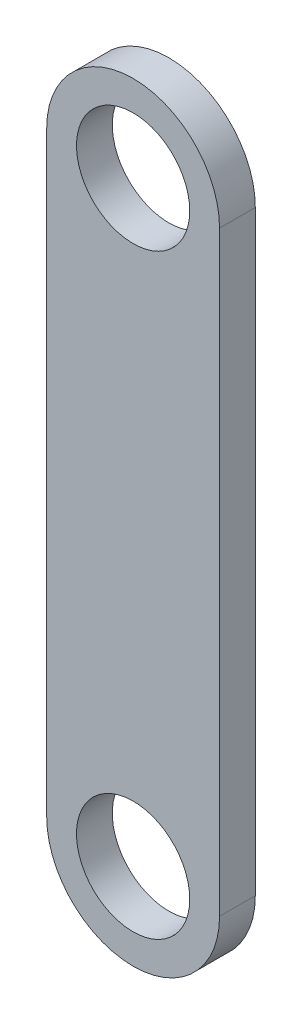
ISO-10303-21;
HEADER;
FILE_DESCRIPTION(('STEP AP214'),'2;1');
FILE_NAME('part.step','',(''),(''),'','','');
FILE_SCHEMA(('AUTOMOTIVE_DESIGN { 1 0 10303 214 1 1 1 1 }'));
ENDSEC;
DATA;
#1=APPLICATION_CONTEXT('core data for automotive mechanical design processes');
#2=APPLICATION_PROTOCOL_DEFINITION('international standard','automotive_design',2000,#1);
#3=PRODUCT_CONTEXT('',#1,'mechanical');
#4=PRODUCT('Part','Part','',(#3));
#5=PRODUCT_RELATED_PRODUCT_CATEGORY('part','',(#4));
#6=PRODUCT_DEFINITION_FORMATION('','',#4);
#7=PRODUCT_DEFINITION_CONTEXT('part definition',#1,'design');
#8=PRODUCT_DEFINITION('design','',#6,#7);
#9=PRODUCT_DEFINITION_SHAPE('','',#8);
#10=(LENGTH_UNIT() NAMED_UNIT(*) SI_UNIT(.MILLI.,.METRE.));
#11=(NAMED_UNIT(*) PLANE_ANGLE_UNIT() SI_UNIT($,.RADIAN.));
#12=(NAMED_UNIT(*) SI_UNIT($,.STERADIAN.) SOLID_ANGLE_UNIT());
#13=UNCERTAINTY_MEASURE_WITH_UNIT(LENGTH_MEASURE(1.E-05),#10,'distance_accuracy_value','');
#14=(GEOMETRIC_REPRESENTATION_CONTEXT(3) GLOBAL_UNCERTAINTY_ASSIGNED_CONTEXT((#13)) GLOBAL_UNIT_ASSIGNED_CONTEXT((#10,
#11,#12)) REPRESENTATION_CONTEXT('',''));
#15=CARTESIAN_POINT('',(0.,0.,0.));
#16=DIRECTION('',(0.,0.,1.));
#17=DIRECTION('',(1.,0.,0.));
#18=AXIS2_PLACEMENT_3D('',#15,#16,#17);
#19=CARTESIAN_POINT('',(14.5,0.,-6.));
#20=DIRECTION('',(-1.,0.,0.));
#21=DIRECTION('',(0.,0.,1.));
#22=AXIS2_PLACEMENT_3D('',#19,#20,#21);
#23=PLANE('',#22);
#24=DIRECTION('',(0.,-1.,0.));
#25=VECTOR('',#24,1.);
#26=CARTESIAN_POINT('',(14.5,0.,0.));
#27=LINE('',#26,#25);
#28=CARTESIAN_POINT('',(14.5,60.3305539747343,0.));
#29=VERTEX_POINT('',#28);
#30=CARTESIAN_POINT('',(14.5,-39.6694460252657,0.));
#31=VERTEX_POINT('',#30);
#32=EDGE_CURVE('E107',#29,#31,#27,.T.);
#33=ORIENTED_EDGE('',*,*,#32,.T.);
#34=DIRECTION('',(0.,0.,1.));
#35=VECTOR('',#34,1.);
#36=CARTESIAN_POINT('',(14.5,-39.6694460252657,-6.));
#37=LINE('',#36,#35);
#38=CARTESIAN_POINT('',(14.5,-39.6694460252657,-6.));
#39=VERTEX_POINT('',#38);
#40=EDGE_CURVE('E11',#39,#31,#37,.T.);
#41=ORIENTED_EDGE('',*,*,#40,.F.);
#42=DIRECTION('',(0.,-1.,0.));
#43=VECTOR('',#42,1.);
#44=CARTESIAN_POINT('',(14.5,0.,-6.));
#45=LINE('',#44,#43);
#46=CARTESIAN_POINT('',(14.5,60.3305539747343,-6.));
#47=VERTEX_POINT('',#46);
#48=EDGE_CURVE('E55',#47,#39,#45,.T.);
#49=ORIENTED_EDGE('',*,*,#48,.F.);
#50=DIRECTION('',(0.,0.,1.));
#51=VECTOR('',#50,1.);
#52=CARTESIAN_POINT('',(14.5,60.3305539747343,-6.));
#53=LINE('',#52,#51);
#54=EDGE_CURVE('E40',#47,#29,#53,.T.);
#55=ORIENTED_EDGE('',*,*,#54,.T.);
#56=EDGE_LOOP('',(#33,#41,#49,#55));
#57=FACE_BOUND('',#56,.T.);
#58=ADVANCED_FACE('F36',(#57),#23,.F.);
#59=CARTESIAN_POINT('',(0.,-39.6694460252657,-6.));
#60=DIRECTION('',(0.,0.,1.));
#61=DIRECTION('',(1.,0.,0.));
#62=AXIS2_PLACEMENT_3D('',#59,#60,#61);
#63=CYLINDRICAL_SURFACE('',#62,14.5);
#64=CARTESIAN_POINT('',(0.,-39.6694460252657,0.));
#65=DIRECTION('',(0.,0.,1.));
#66=DIRECTION('',(1.,0.,0.));
#67=AXIS2_PLACEMENT_3D('',#64,#65,#66);
#68=CIRCLE('',#67,14.5);
#69=CARTESIAN_POINT('',(-14.5,-39.6694460252657,0.));
#70=VERTEX_POINT('',#69);
#71=EDGE_CURVE('E112',#70,#31,#68,.T.);
#72=ORIENTED_EDGE('',*,*,#71,.F.);
#73=DIRECTION('',(0.,0.,1.));
#74=VECTOR('',#73,1.);
#75=CARTESIAN_POINT('',(-14.5,-39.6694460252657,-6.));
#76=LINE('',#75,#74);
#77=CARTESIAN_POINT('',(-14.5,-39.6694460252657,-6.));
#78=VERTEX_POINT('',#77);
#79=EDGE_CURVE('E46',#78,#70,#76,.T.);
#80=ORIENTED_EDGE('',*,*,#79,.F.);
#81=CARTESIAN_POINT('',(0.,-39.6694460252657,-6.));
#82=DIRECTION('',(0.,0.,1.));
#83=DIRECTION('',(1.,0.,0.));
#84=AXIS2_PLACEMENT_3D('',#81,#82,#83);
#85=CIRCLE('',#84,14.5);
#86=EDGE_CURVE('E88',#78,#39,#85,.T.);
#87=ORIENTED_EDGE('',*,*,#86,.T.);
#88=ORIENTED_EDGE('',*,*,#40,.T.);
#89=EDGE_LOOP('',(#72,#80,#87,#88));
#90=FACE_BOUND('',#89,.T.);
#91=ADVANCED_FACE('F136',(#90),#63,.T.);
#92=CARTESIAN_POINT('',(-14.5,0.,-6.));
#93=DIRECTION('',(1.,0.,0.));
#94=DIRECTION('',(0.,0.,-1.));
#95=AXIS2_PLACEMENT_3D('',#92,#93,#94);
#96=PLANE('',#95);
#97=DIRECTION('',(0.,1.,0.));
#98=VECTOR('',#97,1.);
#99=CARTESIAN_POINT('',(-14.5,0.,0.));
#100=LINE('',#99,#98);
#101=CARTESIAN_POINT('',(-14.5,60.3305539747343,0.));
#102=VERTEX_POINT('',#101);
#103=EDGE_CURVE('E92',#70,#102,#100,.T.);
#104=ORIENTED_EDGE('',*,*,#103,.T.);
#105=DIRECTION('',(0.,0.,1.));
#106=VECTOR('',#105,1.);
#107=CARTESIAN_POINT('',(-14.5,60.3305539747343,-6.));
#108=LINE('',#107,#106);
#109=CARTESIAN_POINT('',(-14.5,60.3305539747343,-6.));
#110=VERTEX_POINT('',#109);
#111=EDGE_CURVE('E90',#110,#102,#108,.T.);
#112=ORIENTED_EDGE('',*,*,#111,.F.);
#113=DIRECTION('',(0.,1.,0.));
#114=VECTOR('',#113,1.);
#115=CARTESIAN_POINT('',(-14.5,0.,-6.));
#116=LINE('',#115,#114);
#117=EDGE_CURVE('E84',#78,#110,#116,.T.);
#118=ORIENTED_EDGE('',*,*,#117,.F.);
#119=ORIENTED_EDGE('',*,*,#79,.T.);
#120=EDGE_LOOP('',(#104,#112,#118,#119));
#121=FACE_BOUND('',#120,.T.);
#122=ADVANCED_FACE('F91',(#121),#96,.F.);
#123=CARTESIAN_POINT('',(0.,-39.6694460252657,-6.));
#124=DIRECTION('',(0.,0.,1.));
#125=DIRECTION('',(1.,0.,0.));
#126=AXIS2_PLACEMENT_3D('',#123,#124,#125);
#127=CYLINDRICAL_SURFACE('',#126,9.5);
#128=CARTESIAN_POINT('',(0.,-39.6694460252657,-6.));
#129=DIRECTION('',(0.,0.,1.));
#130=DIRECTION('',(1.,0.,0.));
#131=AXIS2_PLACEMENT_3D('',#128,#129,#130);
#132=CIRCLE('',#131,9.5);
#133=CARTESIAN_POINT('',(9.5,-39.6694460252657,-6.));
#134=VERTEX_POINT('',#133);
#135=EDGE_CURVE('E96',#134,#134,#132,.T.);
#136=ORIENTED_EDGE('',*,*,#135,.F.);
#137=EDGE_LOOP('',(#136));
#138=FACE_BOUND('',#137,.T.);
#139=CARTESIAN_POINT('',(0.,-39.6694460252657,0.));
#140=DIRECTION('',(0.,0.,1.));
#141=DIRECTION('',(1.,0.,0.));
#142=AXIS2_PLACEMENT_3D('',#139,#140,#141);
#143=CIRCLE('',#142,9.5);
#144=CARTESIAN_POINT('',(9.5,-39.6694460252657,0.));
#145=VERTEX_POINT('',#144);
#146=EDGE_CURVE('E104',#145,#145,#143,.T.);
#147=ORIENTED_EDGE('',*,*,#146,.T.);
#148=EDGE_LOOP('',(#147));
#149=FACE_BOUND('',#148,.T.);
#150=ADVANCED_FACE('F126',(#138,#149),#127,.F.);
#151=CARTESIAN_POINT('',(0.,60.3305539747343,-6.));
#152=DIRECTION('',(0.,0.,1.));
#153=DIRECTION('',(1.,0.,0.));
#154=AXIS2_PLACEMENT_3D('',#151,#152,#153);
#155=CYLINDRICAL_SURFACE('',#154,9.5);
#156=CARTESIAN_POINT('',(0.,60.3305539747343,-6.));
#157=DIRECTION('',(0.,0.,1.));
#158=DIRECTION('',(1.,0.,0.));
#159=AXIS2_PLACEMENT_3D('',#156,#157,#158);
#160=CIRCLE('',#159,9.5);
#161=CARTESIAN_POINT('',(9.5,60.3305539747343,-6.));
#162=VERTEX_POINT('',#161);
#163=EDGE_CURVE('E114',#162,#162,#160,.T.);
#164=ORIENTED_EDGE('',*,*,#163,.F.);
#165=EDGE_LOOP('',(#164));
#166=FACE_BOUND('',#165,.T.);
#167=CARTESIAN_POINT('',(0.,60.3305539747343,0.));
#168=DIRECTION('',(0.,0.,1.));
#169=DIRECTION('',(1.,0.,0.));
#170=AXIS2_PLACEMENT_3D('',#167,#168,#169);
#171=CIRCLE('',#170,9.5);
#172=CARTESIAN_POINT('',(9.5,60.3305539747343,0.));
#173=VERTEX_POINT('',#172);
#174=EDGE_CURVE('E101',#173,#173,#171,.T.);
#175=ORIENTED_EDGE('',*,*,#174,.T.);
#176=EDGE_LOOP('',(#175));
#177=FACE_BOUND('',#176,.T.);
#178=ADVANCED_FACE('F38',(#166,#177),#155,.F.);
#179=CARTESIAN_POINT('',(0.,60.3305539747343,-6.));
#180=DIRECTION('',(0.,0.,1.));
#181=DIRECTION('',(1.,0.,0.));
#182=AXIS2_PLACEMENT_3D('',#179,#180,#181);
#183=CYLINDRICAL_SURFACE('',#182,14.5);
#184=CARTESIAN_POINT('',(0.,60.3305539747343,0.));
#185=DIRECTION('',(0.,0.,1.));
#186=DIRECTION('',(1.,0.,0.));
#187=AXIS2_PLACEMENT_3D('',#184,#185,#186);
#188=CIRCLE('',#187,14.5);
#189=EDGE_CURVE('E109',#29,#102,#188,.T.);
#190=ORIENTED_EDGE('',*,*,#189,.F.);
#191=ORIENTED_EDGE('',*,*,#54,.F.);
#192=CARTESIAN_POINT('',(0.,60.3305539747343,-6.));
#193=DIRECTION('',(0.,0.,1.));
#194=DIRECTION('',(1.,0.,0.));
#195=AXIS2_PLACEMENT_3D('',#192,#193,#194);
#196=CIRCLE('',#195,14.5);
#197=EDGE_CURVE('E87',#47,#110,#196,.T.);
#198=ORIENTED_EDGE('',*,*,#197,.T.);
#199=ORIENTED_EDGE('',*,*,#111,.T.);
#200=EDGE_LOOP('',(#190,#191,#198,#199));
#201=FACE_BOUND('',#200,.T.);
#202=ADVANCED_FACE('F94',(#201),#183,.T.);
#203=CARTESIAN_POINT('',(0.,0.,-6.));
#204=DIRECTION('',(0.,0.,1.));
#205=DIRECTION('',(1.,0.,0.));
#206=AXIS2_PLACEMENT_3D('',#203,#204,#205);
#207=PLANE('',#206);
#208=ORIENTED_EDGE('',*,*,#163,.T.);
#209=EDGE_LOOP('',(#208));
#210=FACE_BOUND('',#209,.T.);
#211=ORIENTED_EDGE('',*,*,#135,.T.);
#212=EDGE_LOOP('',(#211));
#213=FACE_BOUND('',#212,.T.);
#214=ORIENTED_EDGE('',*,*,#48,.T.);
#215=ORIENTED_EDGE('',*,*,#86,.F.);
#216=ORIENTED_EDGE('',*,*,#117,.T.);
#217=ORIENTED_EDGE('',*,*,#197,.F.);
#218=EDGE_LOOP('',(#214,#215,#216,#217));
#219=FACE_BOUND('',#218,.T.);
#220=ADVANCED_FACE('F86',(#210,#213,#219),#207,.F.);
#221=CARTESIAN_POINT('',(0.,0.,0.));
#222=DIRECTION('',(0.,0.,1.));
#223=DIRECTION('',(1.,0.,0.));
#224=AXIS2_PLACEMENT_3D('',#221,#222,#223);
#225=PLANE('',#224);
#226=ORIENTED_EDGE('',*,*,#174,.F.);
#227=EDGE_LOOP('',(#226));
#228=FACE_BOUND('',#227,.T.);
#229=ORIENTED_EDGE('',*,*,#146,.F.);
#230=EDGE_LOOP('',(#229));
#231=FACE_BOUND('',#230,.T.);
#232=ORIENTED_EDGE('',*,*,#32,.F.);
#233=ORIENTED_EDGE('',*,*,#189,.T.);
#234=ORIENTED_EDGE('',*,*,#103,.F.);
#235=ORIENTED_EDGE('',*,*,#71,.T.);
#236=EDGE_LOOP('',(#232,#233,#234,#235));
#237=FACE_BOUND('',#236,.T.);
#238=ADVANCED_FACE('F131',(#228,#231,#237),#225,.T.);
#239=CLOSED_SHELL('',(#58,#91,#122,#150,#178,#202,#220,#238));
#240=MANIFOLD_SOLID_BREP('B2',#239);
#241=ADVANCED_BREP_SHAPE_REPRESENTATION('',(#18,#240),#14);
#242=SHAPE_DEFINITION_REPRESENTATION(#9,#241);
ENDSEC;
END-ISO-10303-21;
